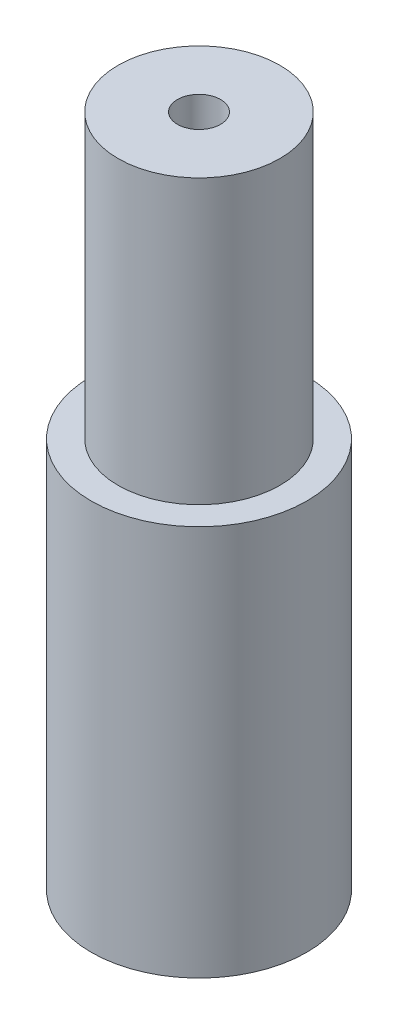
ISO-10303-21;
HEADER;
FILE_DESCRIPTION(('STEP AP214'),'2;1');
FILE_NAME('part.step','',(''),(''),'','','');
FILE_SCHEMA(('AUTOMOTIVE_DESIGN { 1 0 10303 214 1 1 1 1 }'));
ENDSEC;
DATA;
#1=APPLICATION_CONTEXT('core data for automotive mechanical design processes');
#2=APPLICATION_PROTOCOL_DEFINITION('international standard','automotive_design',2000,#1);
#3=PRODUCT_CONTEXT('',#1,'mechanical');
#4=PRODUCT('Part','Part','',(#3));
#5=PRODUCT_RELATED_PRODUCT_CATEGORY('part','',(#4));
#6=PRODUCT_DEFINITION_FORMATION('','',#4);
#7=PRODUCT_DEFINITION_CONTEXT('part definition',#1,'design');
#8=PRODUCT_DEFINITION('design','',#6,#7);
#9=PRODUCT_DEFINITION_SHAPE('','',#8);
#10=(LENGTH_UNIT() NAMED_UNIT(*) SI_UNIT(.MILLI.,.METRE.));
#11=(NAMED_UNIT(*) PLANE_ANGLE_UNIT() SI_UNIT($,.RADIAN.));
#12=(NAMED_UNIT(*) SI_UNIT($,.STERADIAN.) SOLID_ANGLE_UNIT());
#13=UNCERTAINTY_MEASURE_WITH_UNIT(LENGTH_MEASURE(1.E-05),#10,'distance_accuracy_value','');
#14=(GEOMETRIC_REPRESENTATION_CONTEXT(3) GLOBAL_UNCERTAINTY_ASSIGNED_CONTEXT((#13)) GLOBAL_UNIT_ASSIGNED_CONTEXT((#10,
#11,#12)) REPRESENTATION_CONTEXT('',''));
#15=CARTESIAN_POINT('',(0.,0.,0.));
#16=DIRECTION('',(0.,0.,1.));
#17=DIRECTION('',(1.,0.,0.));
#18=AXIS2_PLACEMENT_3D('',#15,#16,#17);
#19=CARTESIAN_POINT('',(0.,14.5,0.));
#20=DIRECTION('',(0.,1.,0.));
#21=DIRECTION('',(0.,0.,1.));
#22=AXIS2_PLACEMENT_3D('',#19,#20,#21);
#23=PLANE('',#22);
#24=CARTESIAN_POINT('',(0.,14.5,0.));
#25=DIRECTION('',(0.,1.,0.));
#26=DIRECTION('',(0.,0.,1.));
#27=AXIS2_PLACEMENT_3D('',#24,#25,#26);
#28=CIRCLE('',#27,4.);
#29=CARTESIAN_POINT('',(0.,14.5,-4.));
#30=VERTEX_POINT('',#29);
#31=EDGE_CURVE('E10',#30,#30,#28,.T.);
#32=ORIENTED_EDGE('',*,*,#31,.T.);
#33=EDGE_LOOP('',(#32));
#34=FACE_BOUND('',#33,.T.);
#35=CARTESIAN_POINT('',(0.,14.5,0.));
#36=DIRECTION('',(0.,1.,0.));
#37=DIRECTION('',(0.,0.,1.));
#38=AXIS2_PLACEMENT_3D('',#35,#36,#37);
#39=CIRCLE('',#38,3.);
#40=CARTESIAN_POINT('',(0.,14.5,-3.));
#41=VERTEX_POINT('',#40);
#42=EDGE_CURVE('E45',#41,#41,#39,.T.);
#43=ORIENTED_EDGE('',*,*,#42,.F.);
#44=EDGE_LOOP('',(#43));
#45=FACE_BOUND('',#44,.T.);
#46=ADVANCED_FACE('F32',(#34,#45),#23,.T.);
#47=CARTESIAN_POINT('',(0.,14.5,0.));
#48=DIRECTION('',(0.,-1.,0.));
#49=DIRECTION('',(0.,0.,-1.));
#50=AXIS2_PLACEMENT_3D('',#47,#48,#49);
#51=CYLINDRICAL_SURFACE('',#50,4.);
#52=CARTESIAN_POINT('',(0.,0.,0.));
#53=DIRECTION('',(0.,1.,0.));
#54=DIRECTION('',(0.,0.,1.));
#55=AXIS2_PLACEMENT_3D('',#52,#53,#54);
#56=CIRCLE('',#55,4.);
#57=CARTESIAN_POINT('',(0.,0.,-4.));
#58=VERTEX_POINT('',#57);
#59=EDGE_CURVE('E36',#58,#58,#56,.T.);
#60=CARTESIAN_POINT('',(0.,14.5,-4.));
#61=CARTESIAN_POINT('',(0.,14.3489583333333,-4.));
#62=CARTESIAN_POINT('',(0.,14.1979166666667,-4.));
#63=CARTESIAN_POINT('',(0.,13.8958333333333,-4.));
#64=CARTESIAN_POINT('',(0.,13.7447916666667,-4.));
#65=CARTESIAN_POINT('',(0.,13.4427083333333,-4.));
#66=CARTESIAN_POINT('',(0.,13.2916666666667,-4.));
#67=CARTESIAN_POINT('',(0.,12.9895833333333,-4.));
#68=CARTESIAN_POINT('',(0.,12.8385416666667,-4.));
#69=CARTESIAN_POINT('',(0.,12.5364583333333,-4.));
#70=CARTESIAN_POINT('',(0.,12.3854166666667,-4.));
#71=CARTESIAN_POINT('',(0.,12.0833333333333,-4.));
#72=CARTESIAN_POINT('',(0.,11.9322916666667,-4.));
#73=CARTESIAN_POINT('',(0.,11.6302083333333,-4.));
#74=CARTESIAN_POINT('',(0.,11.4791666666667,-4.));
#75=CARTESIAN_POINT('',(0.,11.1770833333333,-4.));
#76=CARTESIAN_POINT('',(0.,11.0260416666667,-4.));
#77=CARTESIAN_POINT('',(0.,10.7239583333333,-4.));
#78=CARTESIAN_POINT('',(0.,10.5729166666667,-4.));
#79=CARTESIAN_POINT('',(0.,10.2708333333333,-4.));
#80=CARTESIAN_POINT('',(0.,10.1197916666667,-4.));
#81=CARTESIAN_POINT('',(0.,9.81770833333333,-4.));
#82=CARTESIAN_POINT('',(0.,9.66666666666667,-4.));
#83=CARTESIAN_POINT('',(0.,9.36458333333333,-4.));
#84=CARTESIAN_POINT('',(0.,9.21354166666667,-4.));
#85=CARTESIAN_POINT('',(0.,8.91145833333333,-4.));
#86=CARTESIAN_POINT('',(0.,8.76041666666667,-4.));
#87=CARTESIAN_POINT('',(0.,8.45833333333333,-4.));
#88=CARTESIAN_POINT('',(0.,8.30729166666667,-4.));
#89=CARTESIAN_POINT('',(0.,8.00520833333333,-4.));
#90=CARTESIAN_POINT('',(0.,7.85416666666667,-4.));
#91=CARTESIAN_POINT('',(0.,7.55208333333333,-4.));
#92=CARTESIAN_POINT('',(0.,7.40104166666667,-4.));
#93=CARTESIAN_POINT('',(0.,7.09895833333333,-4.));
#94=CARTESIAN_POINT('',(0.,6.94791666666667,-4.));
#95=CARTESIAN_POINT('',(0.,6.64583333333333,-4.));
#96=CARTESIAN_POINT('',(0.,6.49479166666667,-4.));
#97=CARTESIAN_POINT('',(0.,6.19270833333333,-4.));
#98=CARTESIAN_POINT('',(0.,6.04166666666667,-4.));
#99=CARTESIAN_POINT('',(0.,5.73958333333333,-4.));
#100=CARTESIAN_POINT('',(0.,5.58854166666667,-4.));
#101=CARTESIAN_POINT('',(0.,5.28645833333333,-4.));
#102=CARTESIAN_POINT('',(0.,5.13541666666667,-4.));
#103=CARTESIAN_POINT('',(0.,4.83333333333333,-4.));
#104=CARTESIAN_POINT('',(0.,4.68229166666667,-4.));
#105=CARTESIAN_POINT('',(0.,4.38020833333333,-4.));
#106=CARTESIAN_POINT('',(0.,4.22916666666667,-4.));
#107=CARTESIAN_POINT('',(0.,3.92708333333333,-4.));
#108=CARTESIAN_POINT('',(0.,3.77604166666667,-4.));
#109=CARTESIAN_POINT('',(0.,3.47395833333333,-4.));
#110=CARTESIAN_POINT('',(0.,3.32291666666667,-4.));
#111=CARTESIAN_POINT('',(0.,3.02083333333333,-4.));
#112=CARTESIAN_POINT('',(0.,2.86979166666667,-4.));
#113=CARTESIAN_POINT('',(0.,2.56770833333333,-4.));
#114=CARTESIAN_POINT('',(0.,2.41666666666667,-4.));
#115=CARTESIAN_POINT('',(0.,2.11458333333333,-4.));
#116=CARTESIAN_POINT('',(0.,1.96354166666667,-4.));
#117=CARTESIAN_POINT('',(0.,1.66145833333333,-4.));
#118=CARTESIAN_POINT('',(0.,1.51041666666667,-4.));
#119=CARTESIAN_POINT('',(0.,1.20833333333333,-4.));
#120=CARTESIAN_POINT('',(0.,1.05729166666667,-4.));
#121=CARTESIAN_POINT('',(0.,0.755208333333334,-4.));
#122=CARTESIAN_POINT('',(0.,0.604166666666667,-4.));
#123=CARTESIAN_POINT('',(0.,0.302083333333333,-4.));
#124=CARTESIAN_POINT('',(0.,0.151041666666667,-4.));
#125=CARTESIAN_POINT('',(0.,0.,-4.));
#126=B_SPLINE_CURVE_WITH_KNOTS('',3,(#60,#61,#62,#63,#64,#65,#66,#67,#68,#69,#70,#71,#72,#73,
#74,#75,#76,#77,#78,#79,#80,#81,#82,#83,#84,#85,#86,#87,#88,#89,#90,#91,#92,#93,#94,#95,#96,#97,
#98,#99,#100,#101,#102,#103,#104,#105,#106,#107,#108,#109,#110,#111,#112,#113,#114,#115,#116,
#117,#118,#119,#120,#121,#122,#123,#124,#125),.UNSPECIFIED.,.F.,.F.,(4,2,2,2,2,2,2,2,2,2,2,2,2,
2,2,2,2,2,2,2,2,2,2,2,2,2,2,2,2,2,2,2,4),(0.,0.453125,0.906250000000001,1.359375,1.8125,
2.265625,2.71875,3.171875,3.625,4.078125,4.53125,4.984375,5.4375,5.890625,6.34375,6.796875,7.25,
7.703125,8.15625,8.609375,9.0625,9.515625,9.96875,10.421875,10.875,11.328125,11.78125,12.234375,
12.6875,13.140625,13.59375,14.046875,14.5),.UNSPECIFIED.);
#127=EDGE_CURVE('BSEAM34',#30,#58,#126,.T.);
#128=ORIENTED_EDGE('',*,*,#31,.F.);
#129=ORIENTED_EDGE('',*,*,#59,.T.);
#130=ORIENTED_EDGE('',*,*,#127,.T.);
#131=ORIENTED_EDGE('',*,*,#127,.F.);
#132=EDGE_LOOP('',(#128,#130,#129,#131));
#133=FACE_BOUND('',#132,.T.);
#134=ADVANCED_FACE('F34',(#133),#51,.T.);
#135=CARTESIAN_POINT('',(0.,0.,0.));
#136=DIRECTION('',(0.,1.,0.));
#137=DIRECTION('',(0.,0.,1.));
#138=AXIS2_PLACEMENT_3D('',#135,#136,#137);
#139=PLANE('',#138);
#140=CARTESIAN_POINT('',(0.,0.,0.));
#141=DIRECTION('',(0.,1.,0.));
#142=DIRECTION('',(0.,0.,1.));
#143=AXIS2_PLACEMENT_3D('',#140,#141,#142);
#144=CIRCLE('',#143,0.8);
#145=CARTESIAN_POINT('',(0.,0.,0.8));
#146=VERTEX_POINT('',#145);
#147=EDGE_CURVE('E48',#146,#146,#144,.T.);
#148=ORIENTED_EDGE('',*,*,#147,.T.);
#149=EDGE_LOOP('',(#148));
#150=FACE_BOUND('',#149,.T.);
#151=ORIENTED_EDGE('',*,*,#59,.F.);
#152=EDGE_LOOP('',(#151));
#153=FACE_BOUND('',#152,.T.);
#154=ADVANCED_FACE('F57',(#150,#153),#139,.F.);
#155=CARTESIAN_POINT('',(0.,25.,0.));
#156=DIRECTION('',(0.,-1.,0.));
#157=DIRECTION('',(0.,0.,-1.));
#158=AXIS2_PLACEMENT_3D('',#155,#156,#157);
#159=CYLINDRICAL_SURFACE('',#158,3.);
#160=CARTESIAN_POINT('',(0.,25.,0.));
#161=DIRECTION('',(0.,1.,0.));
#162=DIRECTION('',(0.,0.,1.));
#163=AXIS2_PLACEMENT_3D('',#160,#161,#162);
#164=CIRCLE('',#163,3.);
#165=CARTESIAN_POINT('',(0.,25.,-3.));
#166=VERTEX_POINT('',#165);
#167=EDGE_CURVE('E43',#166,#166,#164,.T.);
#168=CARTESIAN_POINT('',(0.,25.,-3.));
#169=CARTESIAN_POINT('',(0.,24.890625,-3.));
#170=CARTESIAN_POINT('',(0.,24.78125,-3.));
#171=CARTESIAN_POINT('',(0.,24.5625,-3.));
#172=CARTESIAN_POINT('',(0.,24.453125,-3.));
#173=CARTESIAN_POINT('',(0.,24.234375,-3.));
#174=CARTESIAN_POINT('',(0.,24.125,-3.));
#175=CARTESIAN_POINT('',(0.,23.90625,-3.));
#176=CARTESIAN_POINT('',(0.,23.796875,-3.));
#177=CARTESIAN_POINT('',(0.,23.578125,-3.));
#178=CARTESIAN_POINT('',(0.,23.46875,-3.));
#179=CARTESIAN_POINT('',(0.,23.25,-3.));
#180=CARTESIAN_POINT('',(0.,23.140625,-3.));
#181=CARTESIAN_POINT('',(0.,22.921875,-3.));
#182=CARTESIAN_POINT('',(0.,22.8125,-3.));
#183=CARTESIAN_POINT('',(0.,22.59375,-3.));
#184=CARTESIAN_POINT('',(0.,22.484375,-3.));
#185=CARTESIAN_POINT('',(0.,22.265625,-3.));
#186=CARTESIAN_POINT('',(0.,22.15625,-3.));
#187=CARTESIAN_POINT('',(0.,21.9375,-3.));
#188=CARTESIAN_POINT('',(0.,21.828125,-3.));
#189=CARTESIAN_POINT('',(0.,21.609375,-3.));
#190=CARTESIAN_POINT('',(0.,21.5,-3.));
#191=CARTESIAN_POINT('',(0.,21.28125,-3.));
#192=CARTESIAN_POINT('',(0.,21.171875,-3.));
#193=CARTESIAN_POINT('',(0.,20.953125,-3.));
#194=CARTESIAN_POINT('',(0.,20.84375,-3.));
#195=CARTESIAN_POINT('',(0.,20.625,-3.));
#196=CARTESIAN_POINT('',(0.,20.515625,-3.));
#197=CARTESIAN_POINT('',(0.,20.296875,-3.));
#198=CARTESIAN_POINT('',(0.,20.1875,-3.));
#199=CARTESIAN_POINT('',(0.,19.96875,-3.));
#200=CARTESIAN_POINT('',(0.,19.859375,-3.));
#201=CARTESIAN_POINT('',(0.,19.640625,-3.));
#202=CARTESIAN_POINT('',(0.,19.53125,-3.));
#203=CARTESIAN_POINT('',(0.,19.3125,-3.));
#204=CARTESIAN_POINT('',(0.,19.203125,-3.));
#205=CARTESIAN_POINT('',(0.,18.984375,-3.));
#206=CARTESIAN_POINT('',(0.,18.875,-3.));
#207=CARTESIAN_POINT('',(0.,18.65625,-3.));
#208=CARTESIAN_POINT('',(0.,18.546875,-3.));
#209=CARTESIAN_POINT('',(0.,18.328125,-3.));
#210=CARTESIAN_POINT('',(0.,18.21875,-3.));
#211=CARTESIAN_POINT('',(0.,18.,-3.));
#212=CARTESIAN_POINT('',(0.,17.890625,-3.));
#213=CARTESIAN_POINT('',(0.,17.671875,-3.));
#214=CARTESIAN_POINT('',(0.,17.5625,-3.));
#215=CARTESIAN_POINT('',(0.,17.34375,-3.));
#216=CARTESIAN_POINT('',(0.,17.234375,-3.));
#217=CARTESIAN_POINT('',(0.,17.015625,-3.));
#218=CARTESIAN_POINT('',(0.,16.90625,-3.));
#219=CARTESIAN_POINT('',(0.,16.6875,-3.));
#220=CARTESIAN_POINT('',(0.,16.578125,-3.));
#221=CARTESIAN_POINT('',(0.,16.359375,-3.));
#222=CARTESIAN_POINT('',(0.,16.25,-3.));
#223=CARTESIAN_POINT('',(0.,16.03125,-3.));
#224=CARTESIAN_POINT('',(0.,15.921875,-3.));
#225=CARTESIAN_POINT('',(0.,15.703125,-3.));
#226=CARTESIAN_POINT('',(0.,15.59375,-3.));
#227=CARTESIAN_POINT('',(0.,15.375,-3.));
#228=CARTESIAN_POINT('',(0.,15.265625,-3.));
#229=CARTESIAN_POINT('',(0.,15.046875,-3.));
#230=CARTESIAN_POINT('',(0.,14.9375,-3.));
#231=CARTESIAN_POINT('',(0.,14.71875,-3.));
#232=CARTESIAN_POINT('',(0.,14.609375,-3.));
#233=CARTESIAN_POINT('',(0.,14.5,-3.));
#234=B_SPLINE_CURVE_WITH_KNOTS('',3,(#168,#169,#170,#171,#172,#173,#174,#175,#176,#177,#178,
#179,#180,#181,#182,#183,#184,#185,#186,#187,#188,#189,#190,#191,#192,#193,#194,#195,#196,#197,
#198,#199,#200,#201,#202,#203,#204,#205,#206,#207,#208,#209,#210,#211,#212,#213,#214,#215,#216,
#217,#218,#219,#220,#221,#222,#223,#224,#225,#226,#227,#228,#229,#230,#231,#232,#233),
.UNSPECIFIED.,.F.,.F.,(4,2,2,2,2,2,2,2,2,2,2,2,2,2,2,2,2,2,2,2,2,2,2,2,2,2,2,2,2,2,2,2,4),(0.,
0.328125000000002,0.656250000000001,0.984375000000003,1.3125,1.640625,1.96875,2.296875,2.625,
2.953125,3.28125,3.609375,3.9375,4.265625,4.59375,4.921875,5.25,5.578125,5.90625,6.234375,
6.5625,6.890625,7.21875,7.546875,7.875,8.203125,8.53125,8.859375,9.1875,9.515625,9.84375,
10.171875,10.5),.UNSPECIFIED.);
#235=EDGE_CURVE('BSEAM69',#166,#41,#234,.T.);
#236=ORIENTED_EDGE('',*,*,#167,.F.);
#237=ORIENTED_EDGE('',*,*,#42,.T.);
#238=ORIENTED_EDGE('',*,*,#235,.T.);
#239=ORIENTED_EDGE('',*,*,#235,.F.);
#240=EDGE_LOOP('',(#236,#238,#237,#239));
#241=FACE_BOUND('',#240,.T.);
#242=ADVANCED_FACE('F69',(#241),#159,.T.);
#243=CARTESIAN_POINT('',(0.,25.,0.));
#244=DIRECTION('',(0.,1.,0.));
#245=DIRECTION('',(0.,0.,1.));
#246=AXIS2_PLACEMENT_3D('',#243,#244,#245);
#247=PLANE('',#246);
#248=CARTESIAN_POINT('',(0.,25.,0.));
#249=DIRECTION('',(0.,1.,0.));
#250=DIRECTION('',(0.,0.,1.));
#251=AXIS2_PLACEMENT_3D('',#248,#249,#250);
#252=CIRCLE('',#251,0.8);
#253=CARTESIAN_POINT('',(0.,25.,0.8));
#254=VERTEX_POINT('',#253);
#255=EDGE_CURVE('E51',#254,#254,#252,.T.);
#256=ORIENTED_EDGE('',*,*,#255,.F.);
#257=EDGE_LOOP('',(#256));
#258=FACE_BOUND('',#257,.T.);
#259=ORIENTED_EDGE('',*,*,#167,.T.);
#260=EDGE_LOOP('',(#259));
#261=FACE_BOUND('',#260,.T.);
#262=ADVANCED_FACE('F63',(#258,#261),#247,.T.);
#263=CARTESIAN_POINT('',(0.,0.,0.));
#264=DIRECTION('',(0.,1.,0.));
#265=DIRECTION('',(0.,0.,1.));
#266=AXIS2_PLACEMENT_3D('',#263,#264,#265);
#267=CYLINDRICAL_SURFACE('',#266,0.8);
#268=ORIENTED_EDGE('',*,*,#147,.F.);
#269=EDGE_LOOP('',(#268));
#270=FACE_BOUND('',#269,.T.);
#271=ORIENTED_EDGE('',*,*,#255,.T.);
#272=EDGE_LOOP('',(#271));
#273=FACE_BOUND('',#272,.T.);
#274=ADVANCED_FACE('F60',(#270,#273),#267,.F.);
#275=CLOSED_SHELL('',(#46,#134,#154,#242,#262,#274));
#276=MANIFOLD_SOLID_BREP('B2',#275);
#277=ADVANCED_BREP_SHAPE_REPRESENTATION('',(#18,#276),#14);
#278=SHAPE_DEFINITION_REPRESENTATION(#9,#277);
ENDSEC;
END-ISO-10303-21;
